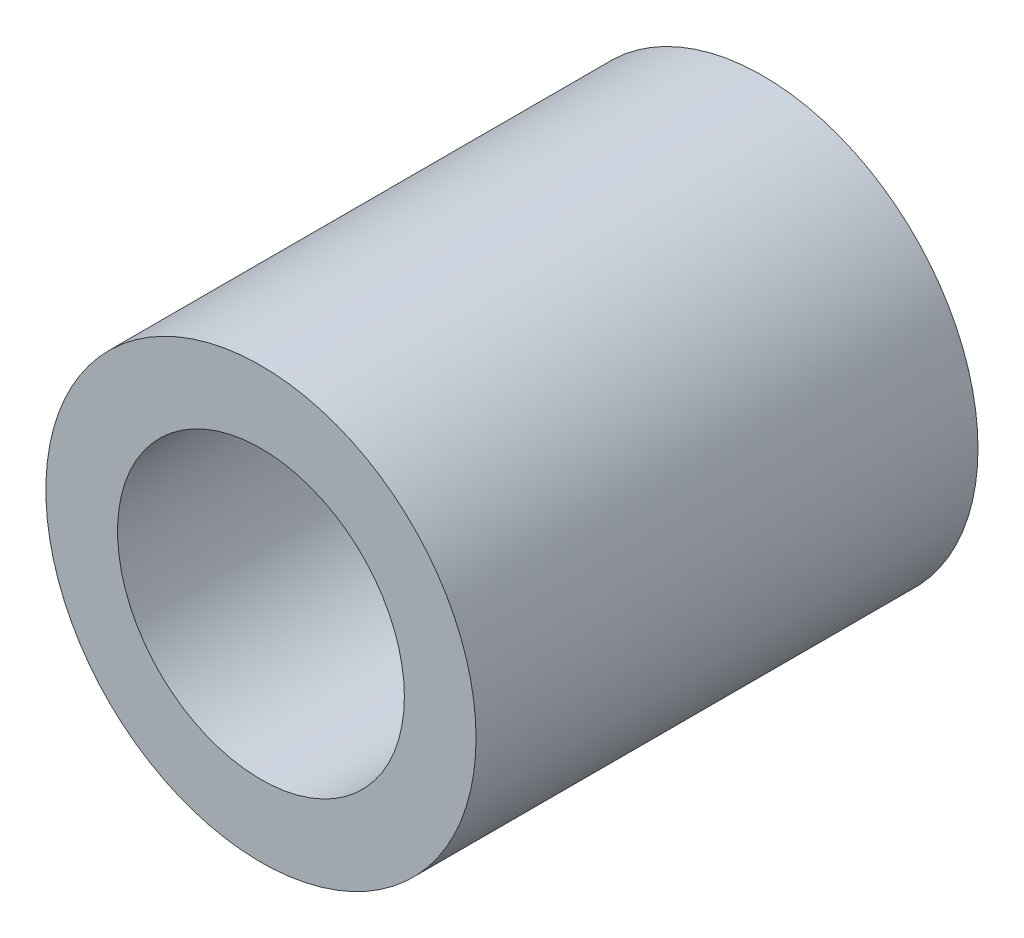
ISO-10303-21;
HEADER;
FILE_DESCRIPTION(('STEP AP214'),'2;1');
FILE_NAME('part.step','',(''),(''),'','','');
FILE_SCHEMA(('AUTOMOTIVE_DESIGN { 1 0 10303 214 1 1 1 1 }'));
ENDSEC;
DATA;
#1=APPLICATION_CONTEXT('core data for automotive mechanical design processes');
#2=APPLICATION_PROTOCOL_DEFINITION('international standard','automotive_design',2000,#1);
#3=PRODUCT_CONTEXT('',#1,'mechanical');
#4=PRODUCT('Part','Part','',(#3));
#5=PRODUCT_RELATED_PRODUCT_CATEGORY('part','',(#4));
#6=PRODUCT_DEFINITION_FORMATION('','',#4);
#7=PRODUCT_DEFINITION_CONTEXT('part definition',#1,'design');
#8=PRODUCT_DEFINITION('design','',#6,#7);
#9=PRODUCT_DEFINITION_SHAPE('','',#8);
#10=(LENGTH_UNIT() NAMED_UNIT(*) SI_UNIT(.MILLI.,.METRE.));
#11=(NAMED_UNIT(*) PLANE_ANGLE_UNIT() SI_UNIT($,.RADIAN.));
#12=(NAMED_UNIT(*) SI_UNIT($,.STERADIAN.) SOLID_ANGLE_UNIT());
#13=UNCERTAINTY_MEASURE_WITH_UNIT(LENGTH_MEASURE(1.E-05),#10,'distance_accuracy_value','');
#14=(GEOMETRIC_REPRESENTATION_CONTEXT(3) GLOBAL_UNCERTAINTY_ASSIGNED_CONTEXT((#13)) GLOBAL_UNIT_ASSIGNED_CONTEXT((#10,
#11,#12)) REPRESENTATION_CONTEXT('',''));
#15=CARTESIAN_POINT('',(0.,0.,0.));
#16=DIRECTION('',(0.,0.,1.));
#17=DIRECTION('',(1.,0.,0.));
#18=AXIS2_PLACEMENT_3D('',#15,#16,#17);
#19=CARTESIAN_POINT('',(0.,0.,7.));
#20=DIRECTION('',(0.,0.,1.));
#21=DIRECTION('',(1.,0.,0.));
#22=AXIS2_PLACEMENT_3D('',#19,#20,#21);
#23=PLANE('',#22);
#24=CARTESIAN_POINT('',(0.,0.,7.));
#25=DIRECTION('',(0.,0.,1.));
#26=DIRECTION('',(1.,0.,0.));
#27=AXIS2_PLACEMENT_3D('',#24,#25,#26);
#28=CIRCLE('',#27,3.);
#29=CARTESIAN_POINT('',(3.,0.,7.));
#30=VERTEX_POINT('',#29);
#31=EDGE_CURVE('E11',#30,#30,#28,.T.);
#32=ORIENTED_EDGE('',*,*,#31,.T.);
#33=EDGE_LOOP('',(#32));
#34=FACE_BOUND('',#33,.T.);
#35=CARTESIAN_POINT('',(0.,0.,7.));
#36=DIRECTION('',(0.,0.,1.));
#37=DIRECTION('',(1.,0.,0.));
#38=AXIS2_PLACEMENT_3D('',#35,#36,#37);
#39=CIRCLE('',#38,2.);
#40=CARTESIAN_POINT('',(2.,0.,7.));
#41=VERTEX_POINT('',#40);
#42=EDGE_CURVE('E47',#41,#41,#39,.T.);
#43=ORIENTED_EDGE('',*,*,#42,.F.);
#44=EDGE_LOOP('',(#43));
#45=FACE_BOUND('',#44,.T.);
#46=ADVANCED_FACE('F36',(#34,#45),#23,.T.);
#47=CARTESIAN_POINT('',(0.,0.,0.));
#48=DIRECTION('',(0.,0.,1.));
#49=DIRECTION('',(1.,0.,0.));
#50=AXIS2_PLACEMENT_3D('',#47,#48,#49);
#51=PLANE('',#50);
#52=CARTESIAN_POINT('',(0.,0.,0.));
#53=DIRECTION('',(0.,0.,1.));
#54=DIRECTION('',(1.,0.,0.));
#55=AXIS2_PLACEMENT_3D('',#52,#53,#54);
#56=CIRCLE('',#55,3.);
#57=CARTESIAN_POINT('',(3.,0.,0.));
#58=VERTEX_POINT('',#57);
#59=EDGE_CURVE('E40',#58,#58,#56,.T.);
#60=ORIENTED_EDGE('',*,*,#59,.F.);
#61=EDGE_LOOP('',(#60));
#62=FACE_BOUND('',#61,.T.);
#63=CARTESIAN_POINT('',(0.,0.,0.));
#64=DIRECTION('',(0.,0.,1.));
#65=DIRECTION('',(1.,0.,0.));
#66=AXIS2_PLACEMENT_3D('',#63,#64,#65);
#67=CIRCLE('',#66,2.);
#68=CARTESIAN_POINT('',(2.,0.,0.));
#69=VERTEX_POINT('',#68);
#70=EDGE_CURVE('E49',#69,#69,#67,.T.);
#71=ORIENTED_EDGE('',*,*,#70,.T.);
#72=EDGE_LOOP('',(#71));
#73=FACE_BOUND('',#72,.T.);
#74=ADVANCED_FACE('F59',(#62,#73),#51,.F.);
#75=CARTESIAN_POINT('',(0.,0.,7.));
#76=DIRECTION('',(0.,0.,-1.));
#77=DIRECTION('',(-1.,0.,0.));
#78=AXIS2_PLACEMENT_3D('',#75,#76,#77);
#79=CYLINDRICAL_SURFACE('',#78,3.);
#80=ORIENTED_EDGE('',*,*,#31,.F.);
#81=EDGE_LOOP('',(#80));
#82=FACE_BOUND('',#81,.T.);
#83=ORIENTED_EDGE('',*,*,#59,.T.);
#84=EDGE_LOOP('',(#83));
#85=FACE_BOUND('',#84,.T.);
#86=ADVANCED_FACE('F38',(#82,#85),#79,.T.);
#87=CARTESIAN_POINT('',(0.,0.,7.));
#88=DIRECTION('',(0.,0.,-1.));
#89=DIRECTION('',(-1.,0.,0.));
#90=AXIS2_PLACEMENT_3D('',#87,#88,#89);
#91=CYLINDRICAL_SURFACE('',#90,2.);
#92=ORIENTED_EDGE('',*,*,#42,.T.);
#93=EDGE_LOOP('',(#92));
#94=FACE_BOUND('',#93,.T.);
#95=ORIENTED_EDGE('',*,*,#70,.F.);
#96=EDGE_LOOP('',(#95));
#97=FACE_BOUND('',#96,.T.);
#98=ADVANCED_FACE('F55',(#94,#97),#91,.F.);
#99=CLOSED_SHELL('',(#46,#74,#86,#98));
#100=MANIFOLD_SOLID_BREP('B2',#99);
#101=ADVANCED_BREP_SHAPE_REPRESENTATION('',(#18,#100),#14);
#102=SHAPE_DEFINITION_REPRESENTATION(#9,#101);
ENDSEC;
END-ISO-10303-21;
